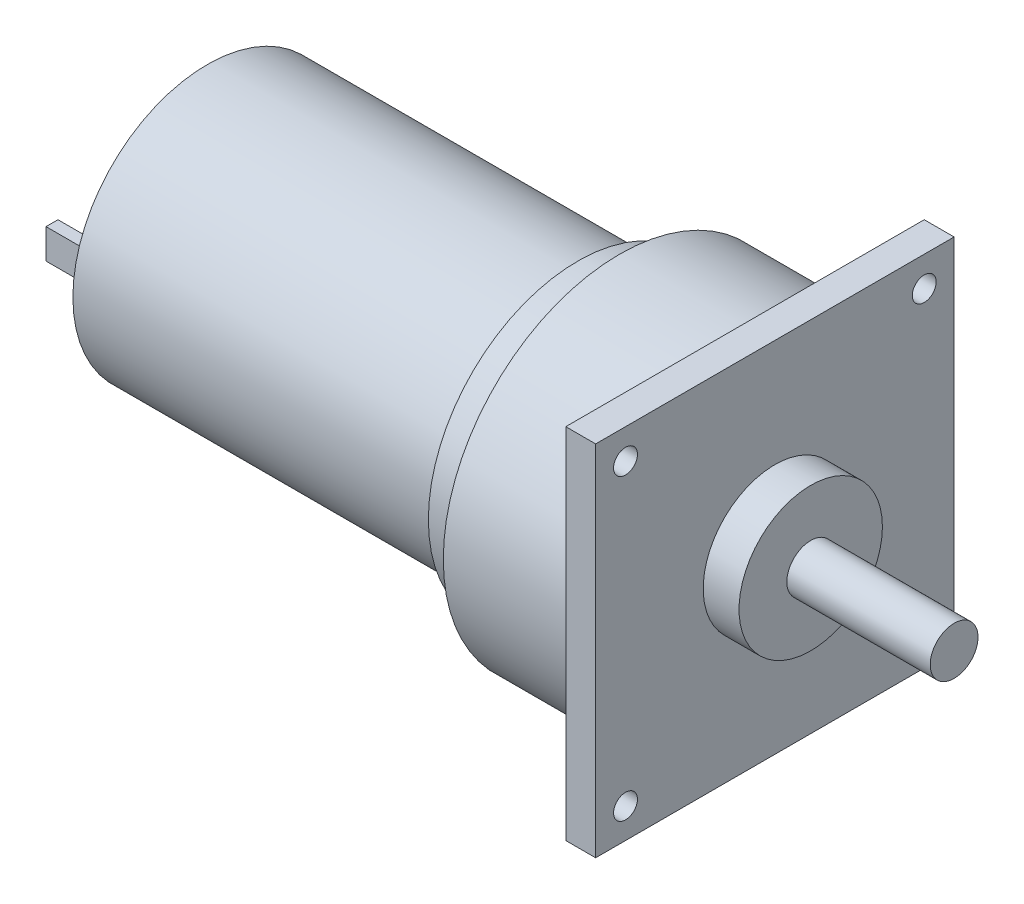
ISO-10303-21;
HEADER;
FILE_DESCRIPTION(('STEP AP214'),'2;1');
FILE_NAME('part.step','',(''),(''),'','','');
FILE_SCHEMA(('AUTOMOTIVE_DESIGN { 1 0 10303 214 1 1 1 1 }'));
ENDSEC;
DATA;
#1=APPLICATION_CONTEXT('core data for automotive mechanical design processes');
#2=APPLICATION_PROTOCOL_DEFINITION('international standard','automotive_design',2000,#1);
#3=PRODUCT_CONTEXT('',#1,'mechanical');
#4=PRODUCT('Part','Part','',(#3));
#5=PRODUCT_RELATED_PRODUCT_CATEGORY('part','',(#4));
#6=PRODUCT_DEFINITION_FORMATION('','',#4);
#7=PRODUCT_DEFINITION_CONTEXT('part definition',#1,'design');
#8=PRODUCT_DEFINITION('design','',#6,#7);
#9=PRODUCT_DEFINITION_SHAPE('','',#8);
#10=(LENGTH_UNIT() NAMED_UNIT(*) SI_UNIT(.MILLI.,.METRE.));
#11=(NAMED_UNIT(*) PLANE_ANGLE_UNIT() SI_UNIT($,.RADIAN.));
#12=(NAMED_UNIT(*) SI_UNIT($,.STERADIAN.) SOLID_ANGLE_UNIT());
#13=UNCERTAINTY_MEASURE_WITH_UNIT(LENGTH_MEASURE(1.E-05),#10,'distance_accuracy_value','');
#14=(GEOMETRIC_REPRESENTATION_CONTEXT(3) GLOBAL_UNCERTAINTY_ASSIGNED_CONTEXT((#13)) GLOBAL_UNIT_ASSIGNED_CONTEXT((#10,
#11,#12)) REPRESENTATION_CONTEXT('',''));
#15=CARTESIAN_POINT('',(0.,0.,0.));
#16=DIRECTION('',(0.,0.,1.));
#17=DIRECTION('',(1.,0.,0.));
#18=AXIS2_PLACEMENT_3D('',#15,#16,#17);
#19=CARTESIAN_POINT('',(-90.,0.,0.));
#20=DIRECTION('',(-1.,0.,0.));
#21=DIRECTION('',(0.,0.,1.));
#22=AXIS2_PLACEMENT_3D('',#19,#20,#21);
#23=PLANE('',#22);
#24=CARTESIAN_POINT('',(-90.,0.,0.));
#25=DIRECTION('',(-1.,0.,0.));
#26=DIRECTION('',(0.,0.,1.));
#27=AXIS2_PLACEMENT_3D('',#24,#25,#26);
#28=CIRCLE('',#27,2.5);
#29=CARTESIAN_POINT('',(-90.,0.,2.5));
#30=VERTEX_POINT('',#29);
#31=EDGE_CURVE('E212',#30,#30,#28,.T.);
#32=ORIENTED_EDGE('',*,*,#31,.F.);
#33=EDGE_LOOP('',(#32));
#34=FACE_BOUND('',#33,.T.);
#35=CARTESIAN_POINT('',(-90.,0.,0.));
#36=DIRECTION('',(-1.,0.,0.));
#37=DIRECTION('',(0.,0.,1.));
#38=AXIS2_PLACEMENT_3D('',#35,#36,#37);
#39=CIRCLE('',#38,22.5);
#40=CARTESIAN_POINT('',(-90.,0.,22.5));
#41=VERTEX_POINT('',#40);
#42=EDGE_CURVE('E264',#41,#41,#39,.T.);
#43=ORIENTED_EDGE('',*,*,#42,.T.);
#44=EDGE_LOOP('',(#43));
#45=FACE_BOUND('',#44,.T.);
#46=DIRECTION('',(0.,0.,-1.));
#47=VECTOR('',#46,1.);
#48=CARTESIAN_POINT('',(-90.,2.5,-17.));
#49=LINE('',#48,#47);
#50=CARTESIAN_POINT('',(-90.,2.5,-15.));
#51=VERTEX_POINT('',#50);
#52=CARTESIAN_POINT('',(-90.,2.5,-17.));
#53=VERTEX_POINT('',#52);
#54=EDGE_CURVE('E173',#51,#53,#49,.T.);
#55=ORIENTED_EDGE('',*,*,#54,.F.);
#56=DIRECTION('',(0.,1.,0.));
#57=VECTOR('',#56,1.);
#58=CARTESIAN_POINT('',(-90.,2.5,-15.));
#59=LINE('',#58,#57);
#60=CARTESIAN_POINT('',(-90.,-2.5,-15.));
#61=VERTEX_POINT('',#60);
#62=EDGE_CURVE('E168',#61,#51,#59,.T.);
#63=ORIENTED_EDGE('',*,*,#62,.F.);
#64=DIRECTION('',(0.,0.,1.));
#65=VECTOR('',#64,1.);
#66=CARTESIAN_POINT('',(-90.,-2.5,-17.));
#67=LINE('',#66,#65);
#68=CARTESIAN_POINT('',(-90.,-2.5,-17.));
#69=VERTEX_POINT('',#68);
#70=EDGE_CURVE('E183',#69,#61,#67,.T.);
#71=ORIENTED_EDGE('',*,*,#70,.F.);
#72=DIRECTION('',(0.,-1.,0.));
#73=VECTOR('',#72,1.);
#74=CARTESIAN_POINT('',(-90.,2.5,-17.));
#75=LINE('',#74,#73);
#76=EDGE_CURVE('E195',#53,#69,#75,.T.);
#77=ORIENTED_EDGE('',*,*,#76,.F.);
#78=EDGE_LOOP('',(#55,#63,#71,#77));
#79=FACE_BOUND('',#78,.T.);
#80=DIRECTION('',(0.,0.,-1.));
#81=VECTOR('',#80,1.);
#82=CARTESIAN_POINT('',(-90.,2.50000000000001,15.));
#83=LINE('',#82,#81);
#84=CARTESIAN_POINT('',(-90.,2.50000000000001,17.));
#85=VERTEX_POINT('',#84);
#86=CARTESIAN_POINT('',(-90.,2.50000000000001,15.));
#87=VERTEX_POINT('',#86);
#88=EDGE_CURVE('E664',#85,#87,#83,.T.);
#89=ORIENTED_EDGE('',*,*,#88,.F.);
#90=DIRECTION('',(0.,1.,0.));
#91=VECTOR('',#90,1.);
#92=CARTESIAN_POINT('',(-90.,2.50000000000001,17.));
#93=LINE('',#92,#91);
#94=CARTESIAN_POINT('',(-90.,-2.49999999999999,17.));
#95=VERTEX_POINT('',#94);
#96=EDGE_CURVE('E165',#95,#85,#93,.T.);
#97=ORIENTED_EDGE('',*,*,#96,.F.);
#98=DIRECTION('',(0.,0.,1.));
#99=VECTOR('',#98,1.);
#100=CARTESIAN_POINT('',(-90.,-2.49999999999999,15.));
#101=LINE('',#100,#99);
#102=CARTESIAN_POINT('',(-90.,-2.49999999999999,15.));
#103=VERTEX_POINT('',#102);
#104=EDGE_CURVE('E161',#103,#95,#101,.T.);
#105=ORIENTED_EDGE('',*,*,#104,.F.);
#106=DIRECTION('',(0.,-1.,0.));
#107=VECTOR('',#106,1.);
#108=CARTESIAN_POINT('',(-90.,2.50000000000001,15.));
#109=LINE('',#108,#107);
#110=EDGE_CURVE('E660',#87,#103,#109,.T.);
#111=ORIENTED_EDGE('',*,*,#110,.F.);
#112=EDGE_LOOP('',(#89,#97,#105,#111));
#113=FACE_BOUND('',#112,.T.);
#114=ADVANCED_FACE('F47',(#34,#45,#79,#113),#23,.T.);
#115=CARTESIAN_POINT('',(5.,30.,-30.));
#116=DIRECTION('',(0.,0.,1.));
#117=DIRECTION('',(0.,-1.,0.));
#118=AXIS2_PLACEMENT_3D('',#115,#116,#117);
#119=PLANE('',#118);
#120=DIRECTION('',(0.,1.,0.));
#121=VECTOR('',#120,1.);
#122=CARTESIAN_POINT('',(0.,30.,-30.));
#123=LINE('',#122,#121);
#124=CARTESIAN_POINT('',(0.,-30.,-30.));
#125=VERTEX_POINT('',#124);
#126=CARTESIAN_POINT('',(0.,30.,-30.));
#127=VERTEX_POINT('',#126);
#128=EDGE_CURVE('E280',#125,#127,#123,.T.);
#129=ORIENTED_EDGE('',*,*,#128,.T.);
#130=DIRECTION('',(-1.,0.,0.));
#131=VECTOR('',#130,1.);
#132=CARTESIAN_POINT('',(5.,30.,-30.));
#133=LINE('',#132,#131);
#134=CARTESIAN_POINT('',(5.,30.,-30.));
#135=VERTEX_POINT('',#134);
#136=EDGE_CURVE('E284',#135,#127,#133,.T.);
#137=ORIENTED_EDGE('',*,*,#136,.F.);
#138=DIRECTION('',(0.,1.,0.));
#139=VECTOR('',#138,1.);
#140=CARTESIAN_POINT('',(5.,30.,-30.));
#141=LINE('',#140,#139);
#142=CARTESIAN_POINT('',(5.,-30.,-30.));
#143=VERTEX_POINT('',#142);
#144=EDGE_CURVE('E285',#143,#135,#141,.T.);
#145=ORIENTED_EDGE('',*,*,#144,.F.);
#146=DIRECTION('',(-1.,0.,0.));
#147=VECTOR('',#146,1.);
#148=CARTESIAN_POINT('',(5.,-30.,-30.));
#149=LINE('',#148,#147);
#150=EDGE_CURVE('E299',#143,#125,#149,.T.);
#151=ORIENTED_EDGE('',*,*,#150,.T.);
#152=EDGE_LOOP('',(#129,#137,#145,#151));
#153=FACE_BOUND('',#152,.T.);
#154=ADVANCED_FACE('F49',(#153),#119,.F.);
#155=CARTESIAN_POINT('',(5.,30.,30.));
#156=DIRECTION('',(0.,-1.,0.));
#157=DIRECTION('',(0.,0.,-1.));
#158=AXIS2_PLACEMENT_3D('',#155,#156,#157);
#159=PLANE('',#158);
#160=DIRECTION('',(0.,0.,1.));
#161=VECTOR('',#160,1.);
#162=CARTESIAN_POINT('',(0.,30.,30.));
#163=LINE('',#162,#161);
#164=CARTESIAN_POINT('',(0.,30.,30.));
#165=VERTEX_POINT('',#164);
#166=EDGE_CURVE('E303',#127,#165,#163,.T.);
#167=ORIENTED_EDGE('',*,*,#166,.T.);
#168=DIRECTION('',(-1.,0.,0.));
#169=VECTOR('',#168,1.);
#170=CARTESIAN_POINT('',(5.,30.,30.));
#171=LINE('',#170,#169);
#172=CARTESIAN_POINT('',(5.,30.,30.));
#173=VERTEX_POINT('',#172);
#174=EDGE_CURVE('E318',#173,#165,#171,.T.);
#175=ORIENTED_EDGE('',*,*,#174,.F.);
#176=DIRECTION('',(0.,0.,1.));
#177=VECTOR('',#176,1.);
#178=CARTESIAN_POINT('',(5.,30.,30.));
#179=LINE('',#178,#177);
#180=EDGE_CURVE('E289',#135,#173,#179,.T.);
#181=ORIENTED_EDGE('',*,*,#180,.F.);
#182=ORIENTED_EDGE('',*,*,#136,.T.);
#183=EDGE_LOOP('',(#167,#175,#181,#182));
#184=FACE_BOUND('',#183,.T.);
#185=ADVANCED_FACE('F325',(#184),#159,.F.);
#186=CARTESIAN_POINT('',(5.,30.,30.));
#187=DIRECTION('',(0.,0.,-1.));
#188=DIRECTION('',(0.,1.,0.));
#189=AXIS2_PLACEMENT_3D('',#186,#187,#188);
#190=PLANE('',#189);
#191=DIRECTION('',(0.,-1.,0.));
#192=VECTOR('',#191,1.);
#193=CARTESIAN_POINT('',(0.,30.,30.));
#194=LINE('',#193,#192);
#195=CARTESIAN_POINT('',(0.,-30.,30.));
#196=VERTEX_POINT('',#195);
#197=EDGE_CURVE('E306',#165,#196,#194,.T.);
#198=ORIENTED_EDGE('',*,*,#197,.T.);
#199=DIRECTION('',(-1.,0.,0.));
#200=VECTOR('',#199,1.);
#201=CARTESIAN_POINT('',(5.,-30.,30.));
#202=LINE('',#201,#200);
#203=CARTESIAN_POINT('',(5.,-30.,30.));
#204=VERTEX_POINT('',#203);
#205=EDGE_CURVE('E314',#204,#196,#202,.T.);
#206=ORIENTED_EDGE('',*,*,#205,.F.);
#207=DIRECTION('',(0.,-1.,0.));
#208=VECTOR('',#207,1.);
#209=CARTESIAN_POINT('',(5.,30.,30.));
#210=LINE('',#209,#208);
#211=EDGE_CURVE('E293',#173,#204,#210,.T.);
#212=ORIENTED_EDGE('',*,*,#211,.F.);
#213=ORIENTED_EDGE('',*,*,#174,.T.);
#214=EDGE_LOOP('',(#198,#206,#212,#213));
#215=FACE_BOUND('',#214,.T.);
#216=ADVANCED_FACE('F337',(#215),#190,.F.);
#217=CARTESIAN_POINT('',(5.,-30.,30.));
#218=DIRECTION('',(0.,1.,0.));
#219=DIRECTION('',(0.,0.,1.));
#220=AXIS2_PLACEMENT_3D('',#217,#218,#219);
#221=PLANE('',#220);
#222=DIRECTION('',(0.,0.,-1.));
#223=VECTOR('',#222,1.);
#224=CARTESIAN_POINT('',(0.,-30.,30.));
#225=LINE('',#224,#223);
#226=EDGE_CURVE('E290',#196,#125,#225,.T.);
#227=ORIENTED_EDGE('',*,*,#226,.T.);
#228=ORIENTED_EDGE('',*,*,#150,.F.);
#229=DIRECTION('',(0.,0.,-1.));
#230=VECTOR('',#229,1.);
#231=CARTESIAN_POINT('',(5.,-30.,30.));
#232=LINE('',#231,#230);
#233=EDGE_CURVE('E296',#204,#143,#232,.T.);
#234=ORIENTED_EDGE('',*,*,#233,.F.);
#235=ORIENTED_EDGE('',*,*,#205,.T.);
#236=EDGE_LOOP('',(#227,#228,#234,#235));
#237=FACE_BOUND('',#236,.T.);
#238=ADVANCED_FACE('F341',(#237),#221,.F.);
#239=CARTESIAN_POINT('',(5.,0.,0.));
#240=DIRECTION('',(1.,0.,0.));
#241=DIRECTION('',(0.,0.,-1.));
#242=AXIS2_PLACEMENT_3D('',#239,#240,#241);
#243=PLANE('',#242);
#244=CARTESIAN_POINT('',(5.,0.,0.));
#245=DIRECTION('',(1.,0.,0.));
#246=DIRECTION('',(0.,0.,-1.));
#247=AXIS2_PLACEMENT_3D('',#244,#245,#246);
#248=CIRCLE('',#247,12.);
#249=CARTESIAN_POINT('',(5.,0.,-12.));
#250=VERTEX_POINT('',#249);
#251=EDGE_CURVE('E229',#250,#250,#248,.T.);
#252=ORIENTED_EDGE('',*,*,#251,.F.);
#253=EDGE_LOOP('',(#252));
#254=FACE_BOUND('',#253,.T.);
#255=CARTESIAN_POINT('',(5.,-25.,25.));
#256=DIRECTION('',(1.,0.,0.));
#257=DIRECTION('',(0.,0.,-1.));
#258=AXIS2_PLACEMENT_3D('',#255,#256,#257);
#259=CIRCLE('',#258,2.);
#260=CARTESIAN_POINT('',(5.,-25.,23.));
#261=VERTEX_POINT('',#260);
#262=EDGE_CURVE('E228',#261,#261,#259,.T.);
#263=ORIENTED_EDGE('',*,*,#262,.F.);
#264=EDGE_LOOP('',(#263));
#265=FACE_BOUND('',#264,.T.);
#266=CARTESIAN_POINT('',(5.,-25.,-25.));
#267=DIRECTION('',(1.,0.,0.));
#268=DIRECTION('',(0.,0.,-1.));
#269=AXIS2_PLACEMENT_3D('',#266,#267,#268);
#270=CIRCLE('',#269,2.);
#271=CARTESIAN_POINT('',(5.,-25.,-27.));
#272=VERTEX_POINT('',#271);
#273=EDGE_CURVE('E243',#272,#272,#270,.T.);
#274=ORIENTED_EDGE('',*,*,#273,.F.);
#275=EDGE_LOOP('',(#274));
#276=FACE_BOUND('',#275,.T.);
#277=CARTESIAN_POINT('',(5.,25.,-25.));
#278=DIRECTION('',(1.,0.,0.));
#279=DIRECTION('',(0.,0.,-1.));
#280=AXIS2_PLACEMENT_3D('',#277,#278,#279);
#281=CIRCLE('',#280,2.);
#282=CARTESIAN_POINT('',(5.,25.,-27.));
#283=VERTEX_POINT('',#282);
#284=EDGE_CURVE('E233',#283,#283,#281,.T.);
#285=ORIENTED_EDGE('',*,*,#284,.F.);
#286=EDGE_LOOP('',(#285));
#287=FACE_BOUND('',#286,.T.);
#288=CARTESIAN_POINT('',(5.,25.,25.));
#289=DIRECTION('',(1.,0.,0.));
#290=DIRECTION('',(0.,0.,-1.));
#291=AXIS2_PLACEMENT_3D('',#288,#289,#290);
#292=CIRCLE('',#291,2.);
#293=CARTESIAN_POINT('',(5.,25.,23.));
#294=VERTEX_POINT('',#293);
#295=EDGE_CURVE('E242',#294,#294,#292,.T.);
#296=ORIENTED_EDGE('',*,*,#295,.F.);
#297=EDGE_LOOP('',(#296));
#298=FACE_BOUND('',#297,.T.);
#299=ORIENTED_EDGE('',*,*,#144,.T.);
#300=ORIENTED_EDGE('',*,*,#180,.T.);
#301=ORIENTED_EDGE('',*,*,#211,.T.);
#302=ORIENTED_EDGE('',*,*,#233,.T.);
#303=EDGE_LOOP('',(#299,#300,#301,#302));
#304=FACE_BOUND('',#303,.T.);
#305=ADVANCED_FACE('F343',(#254,#265,#276,#287,#298,#304),#243,.T.);
#306=CARTESIAN_POINT('',(0.,0.,0.));
#307=DIRECTION('',(1.,0.,0.));
#308=DIRECTION('',(0.,0.,-1.));
#309=AXIS2_PLACEMENT_3D('',#306,#307,#308);
#310=PLANE('',#309);
#311=CARTESIAN_POINT('',(0.,-25.,25.));
#312=DIRECTION('',(1.,0.,0.));
#313=DIRECTION('',(0.,0.,-1.));
#314=AXIS2_PLACEMENT_3D('',#311,#312,#313);
#315=CIRCLE('',#314,2.);
#316=CARTESIAN_POINT('',(0.,-25.,23.));
#317=VERTEX_POINT('',#316);
#318=EDGE_CURVE('E247',#317,#317,#315,.F.);
#319=ORIENTED_EDGE('',*,*,#318,.F.);
#320=EDGE_LOOP('',(#319));
#321=FACE_BOUND('',#320,.T.);
#322=CARTESIAN_POINT('',(0.,-25.,-25.));
#323=DIRECTION('',(1.,0.,0.));
#324=DIRECTION('',(0.,0.,-1.));
#325=AXIS2_PLACEMENT_3D('',#322,#323,#324);
#326=CIRCLE('',#325,2.);
#327=CARTESIAN_POINT('',(0.,-25.,-27.));
#328=VERTEX_POINT('',#327);
#329=EDGE_CURVE('E238',#328,#328,#326,.F.);
#330=ORIENTED_EDGE('',*,*,#329,.F.);
#331=EDGE_LOOP('',(#330));
#332=FACE_BOUND('',#331,.T.);
#333=CARTESIAN_POINT('',(0.,25.,-25.));
#334=DIRECTION('',(1.,0.,0.));
#335=DIRECTION('',(0.,0.,-1.));
#336=AXIS2_PLACEMENT_3D('',#333,#334,#335);
#337=CIRCLE('',#336,2.);
#338=CARTESIAN_POINT('',(0.,25.,-27.));
#339=VERTEX_POINT('',#338);
#340=EDGE_CURVE('E237',#339,#339,#337,.F.);
#341=ORIENTED_EDGE('',*,*,#340,.F.);
#342=EDGE_LOOP('',(#341));
#343=FACE_BOUND('',#342,.T.);
#344=CARTESIAN_POINT('',(0.,25.,25.));
#345=DIRECTION('',(1.,0.,0.));
#346=DIRECTION('',(0.,0.,-1.));
#347=AXIS2_PLACEMENT_3D('',#344,#345,#346);
#348=CIRCLE('',#347,2.);
#349=CARTESIAN_POINT('',(0.,25.,23.));
#350=VERTEX_POINT('',#349);
#351=EDGE_CURVE('E260',#350,#350,#348,.F.);
#352=ORIENTED_EDGE('',*,*,#351,.F.);
#353=EDGE_LOOP('',(#352));
#354=FACE_BOUND('',#353,.T.);
#355=CARTESIAN_POINT('',(0.,0.,0.));
#356=DIRECTION('',(-1.,0.,0.));
#357=DIRECTION('',(0.,0.,1.));
#358=AXIS2_PLACEMENT_3D('',#355,#356,#357);
#359=CIRCLE('',#358,29.5);
#360=CARTESIAN_POINT('',(0.,0.,-29.5));
#361=VERTEX_POINT('',#360);
#362=EDGE_CURVE('E276',#361,#361,#359,.T.);
#363=ORIENTED_EDGE('',*,*,#362,.F.);
#364=EDGE_LOOP('',(#363));
#365=FACE_BOUND('',#364,.T.);
#366=ORIENTED_EDGE('',*,*,#128,.F.);
#367=ORIENTED_EDGE('',*,*,#226,.F.);
#368=ORIENTED_EDGE('',*,*,#197,.F.);
#369=ORIENTED_EDGE('',*,*,#166,.F.);
#370=EDGE_LOOP('',(#366,#367,#368,#369));
#371=FACE_BOUND('',#370,.T.);
#372=ADVANCED_FACE('F333',(#321,#332,#343,#354,#365,#371),#310,.F.);
#373=CARTESIAN_POINT('',(-21.,0.,0.));
#374=DIRECTION('',(1.,0.,0.));
#375=DIRECTION('',(0.,0.,-1.));
#376=AXIS2_PLACEMENT_3D('',#373,#374,#375);
#377=CYLINDRICAL_SURFACE('',#376,29.5);
#378=CARTESIAN_POINT('',(-21.,0.,0.));
#379=DIRECTION('',(-1.,0.,0.));
#380=DIRECTION('',(0.,0.,1.));
#381=AXIS2_PLACEMENT_3D('',#378,#379,#380);
#382=CIRCLE('',#381,29.5);
#383=CARTESIAN_POINT('',(-21.,0.,-29.5));
#384=VERTEX_POINT('',#383);
#385=EDGE_CURVE('E272',#384,#384,#382,.T.);
#386=CARTESIAN_POINT('',(-21.,0.,-29.5));
#387=CARTESIAN_POINT('',(-20.78125,0.,-29.5));
#388=CARTESIAN_POINT('',(-20.5625,0.,-29.5));
#389=CARTESIAN_POINT('',(-20.125,0.,-29.5));
#390=CARTESIAN_POINT('',(-19.90625,0.,-29.5));
#391=CARTESIAN_POINT('',(-19.46875,0.,-29.5));
#392=CARTESIAN_POINT('',(-19.25,0.,-29.5));
#393=CARTESIAN_POINT('',(-18.8125,0.,-29.5));
#394=CARTESIAN_POINT('',(-18.59375,0.,-29.5));
#395=CARTESIAN_POINT('',(-18.15625,0.,-29.5));
#396=CARTESIAN_POINT('',(-17.9375,0.,-29.5));
#397=CARTESIAN_POINT('',(-17.5,0.,-29.5));
#398=CARTESIAN_POINT('',(-17.28125,0.,-29.5));
#399=CARTESIAN_POINT('',(-16.84375,0.,-29.5));
#400=CARTESIAN_POINT('',(-16.625,0.,-29.5));
#401=CARTESIAN_POINT('',(-16.1875,0.,-29.5));
#402=CARTESIAN_POINT('',(-15.96875,0.,-29.5));
#403=CARTESIAN_POINT('',(-15.53125,0.,-29.5));
#404=CARTESIAN_POINT('',(-15.3125,0.,-29.5));
#405=CARTESIAN_POINT('',(-14.875,0.,-29.5));
#406=CARTESIAN_POINT('',(-14.65625,0.,-29.5));
#407=CARTESIAN_POINT('',(-14.21875,0.,-29.5));
#408=CARTESIAN_POINT('',(-14.,0.,-29.5));
#409=CARTESIAN_POINT('',(-13.5625,0.,-29.5));
#410=CARTESIAN_POINT('',(-13.34375,0.,-29.5));
#411=CARTESIAN_POINT('',(-12.90625,0.,-29.5));
#412=CARTESIAN_POINT('',(-12.6875,0.,-29.5));
#413=CARTESIAN_POINT('',(-12.25,0.,-29.5));
#414=CARTESIAN_POINT('',(-12.03125,0.,-29.5));
#415=CARTESIAN_POINT('',(-11.59375,0.,-29.5));
#416=CARTESIAN_POINT('',(-11.375,0.,-29.5));
#417=CARTESIAN_POINT('',(-10.9375,0.,-29.5));
#418=CARTESIAN_POINT('',(-10.71875,0.,-29.5));
#419=CARTESIAN_POINT('',(-10.28125,0.,-29.5));
#420=CARTESIAN_POINT('',(-10.0625,0.,-29.5));
#421=CARTESIAN_POINT('',(-9.625,0.,-29.5));
#422=CARTESIAN_POINT('',(-9.40625,0.,-29.5));
#423=CARTESIAN_POINT('',(-8.96875,0.,-29.5));
#424=CARTESIAN_POINT('',(-8.75,0.,-29.5));
#425=CARTESIAN_POINT('',(-8.3125,0.,-29.5));
#426=CARTESIAN_POINT('',(-8.09375,0.,-29.5));
#427=CARTESIAN_POINT('',(-7.65625,0.,-29.5));
#428=CARTESIAN_POINT('',(-7.4375,0.,-29.5));
#429=CARTESIAN_POINT('',(-7.,0.,-29.5));
#430=CARTESIAN_POINT('',(-6.78125,0.,-29.5));
#431=CARTESIAN_POINT('',(-6.34375,0.,-29.5));
#432=CARTESIAN_POINT('',(-6.125,0.,-29.5));
#433=CARTESIAN_POINT('',(-5.6875,0.,-29.5));
#434=CARTESIAN_POINT('',(-5.46875,0.,-29.5));
#435=CARTESIAN_POINT('',(-5.03125,0.,-29.5));
#436=CARTESIAN_POINT('',(-4.8125,0.,-29.5));
#437=CARTESIAN_POINT('',(-4.375,0.,-29.5));
#438=CARTESIAN_POINT('',(-4.15625,0.,-29.5));
#439=CARTESIAN_POINT('',(-3.71875,0.,-29.5));
#440=CARTESIAN_POINT('',(-3.5,0.,-29.5));
#441=CARTESIAN_POINT('',(-3.0625,0.,-29.5));
#442=CARTESIAN_POINT('',(-2.84375,0.,-29.5));
#443=CARTESIAN_POINT('',(-2.40625,0.,-29.5));
#444=CARTESIAN_POINT('',(-2.1875,0.,-29.5));
#445=CARTESIAN_POINT('',(-1.75,0.,-29.5));
#446=CARTESIAN_POINT('',(-1.53125,0.,-29.5));
#447=CARTESIAN_POINT('',(-1.09375,0.,-29.5));
#448=CARTESIAN_POINT('',(-0.875000000000001,0.,-29.5));
#449=CARTESIAN_POINT('',(-0.4375,0.,-29.5));
#450=CARTESIAN_POINT('',(-0.21875,0.,-29.5));
#451=CARTESIAN_POINT('',(0.,0.,-29.5));
#452=B_SPLINE_CURVE_WITH_KNOTS('',3,(#386,#387,#388,#389,#390,#391,#392,#393,#394,#395,#396,
#397,#398,#399,#400,#401,#402,#403,#404,#405,#406,#407,#408,#409,#410,#411,#412,#413,#414,#415,
#416,#417,#418,#419,#420,#421,#422,#423,#424,#425,#426,#427,#428,#429,#430,#431,#432,#433,#434,
#435,#436,#437,#438,#439,#440,#441,#442,#443,#444,#445,#446,#447,#448,#449,#450,#451),
.UNSPECIFIED.,.F.,.F.,(4,2,2,2,2,2,2,2,2,2,2,2,2,2,2,2,2,2,2,2,2,2,2,2,2,2,2,2,2,2,2,2,4),(0.,
0.656249999999997,1.3125,1.96875,2.625,3.28125,3.9375,4.59375,5.25,5.90625,6.5625,7.21875,7.875,
8.53125,9.1875,9.84375,10.5,11.15625,11.8125,12.46875,13.125,13.78125,14.4375,15.09375,15.75,
16.40625,17.0625,17.71875,18.375,19.03125,19.6875,20.34375,21.),.UNSPECIFIED.);
#453=EDGE_CURVE('BSEAM352',#384,#361,#452,.T.);
#454=ORIENTED_EDGE('',*,*,#385,.F.);
#455=ORIENTED_EDGE('',*,*,#362,.T.);
#456=ORIENTED_EDGE('',*,*,#453,.T.);
#457=ORIENTED_EDGE('',*,*,#453,.F.);
#458=EDGE_LOOP('',(#454,#456,#455,#457));
#459=FACE_BOUND('',#458,.T.);
#460=ADVANCED_FACE('F352',(#459),#377,.T.);
#461=CARTESIAN_POINT('',(-21.,0.,0.));
#462=DIRECTION('',(-1.,0.,0.));
#463=DIRECTION('',(0.,0.,1.));
#464=AXIS2_PLACEMENT_3D('',#461,#462,#463);
#465=PLANE('',#464);
#466=CARTESIAN_POINT('',(-21.,0.,0.));
#467=DIRECTION('',(-1.,0.,0.));
#468=DIRECTION('',(0.,0.,1.));
#469=AXIS2_PLACEMENT_3D('',#466,#467,#468);
#470=CIRCLE('',#469,25.);
#471=CARTESIAN_POINT('',(-21.,0.,25.));
#472=VERTEX_POINT('',#471);
#473=EDGE_CURVE('E57',#472,#472,#470,.T.);
#474=ORIENTED_EDGE('',*,*,#473,.F.);
#475=EDGE_LOOP('',(#474));
#476=FACE_BOUND('',#475,.T.);
#477=ORIENTED_EDGE('',*,*,#385,.T.);
#478=EDGE_LOOP('',(#477));
#479=FACE_BOUND('',#478,.T.);
#480=ADVANCED_FACE('F385',(#476,#479),#465,.T.);
#481=CARTESIAN_POINT('',(-28.,0.,0.));
#482=DIRECTION('',(1.,0.,0.));
#483=DIRECTION('',(0.,0.,-1.));
#484=AXIS2_PLACEMENT_3D('',#481,#482,#483);
#485=CYLINDRICAL_SURFACE('',#484,25.);
#486=CARTESIAN_POINT('',(-28.,0.,0.));
#487=DIRECTION('',(-1.,0.,0.));
#488=DIRECTION('',(0.,0.,1.));
#489=AXIS2_PLACEMENT_3D('',#486,#487,#488);
#490=CIRCLE('',#489,25.);
#491=CARTESIAN_POINT('',(-28.,0.,25.));
#492=VERTEX_POINT('',#491);
#493=EDGE_CURVE('E267',#492,#492,#490,.T.);
#494=ORIENTED_EDGE('',*,*,#493,.F.);
#495=EDGE_LOOP('',(#494));
#496=FACE_BOUND('',#495,.T.);
#497=ORIENTED_EDGE('',*,*,#473,.T.);
#498=EDGE_LOOP('',(#497));
#499=FACE_BOUND('',#498,.T.);
#500=ADVANCED_FACE('F381',(#496,#499),#485,.T.);
#501=CARTESIAN_POINT('',(-28.,0.,0.));
#502=DIRECTION('',(-1.,0.,0.));
#503=DIRECTION('',(0.,0.,1.));
#504=AXIS2_PLACEMENT_3D('',#501,#502,#503);
#505=PLANE('',#504);
#506=CARTESIAN_POINT('',(-28.,0.,0.));
#507=DIRECTION('',(-1.,0.,0.));
#508=DIRECTION('',(0.,0.,1.));
#509=AXIS2_PLACEMENT_3D('',#506,#507,#508);
#510=CIRCLE('',#509,22.5);
#511=CARTESIAN_POINT('',(-28.,0.,22.5));
#512=VERTEX_POINT('',#511);
#513=EDGE_CURVE('E11',#512,#512,#510,.T.);
#514=ORIENTED_EDGE('',*,*,#513,.F.);
#515=EDGE_LOOP('',(#514));
#516=FACE_BOUND('',#515,.T.);
#517=ORIENTED_EDGE('',*,*,#493,.T.);
#518=EDGE_LOOP('',(#517));
#519=FACE_BOUND('',#518,.T.);
#520=ADVANCED_FACE('F377',(#516,#519),#505,.T.);
#521=CARTESIAN_POINT('',(-90.,0.,0.));
#522=DIRECTION('',(1.,0.,0.));
#523=DIRECTION('',(0.,0.,-1.));
#524=AXIS2_PLACEMENT_3D('',#521,#522,#523);
#525=CYLINDRICAL_SURFACE('',#524,22.5);
#526=ORIENTED_EDGE('',*,*,#42,.F.);
#527=EDGE_LOOP('',(#526));
#528=FACE_BOUND('',#527,.T.);
#529=ORIENTED_EDGE('',*,*,#513,.T.);
#530=EDGE_LOOP('',(#529));
#531=FACE_BOUND('',#530,.T.);
#532=ADVANCED_FACE('F374',(#528,#531),#525,.T.);
#533=CARTESIAN_POINT('',(-90.001,25.,25.));
#534=DIRECTION('',(1.,0.,0.));
#535=DIRECTION('',(0.,0.,-1.));
#536=AXIS2_PLACEMENT_3D('',#533,#534,#535);
#537=CYLINDRICAL_SURFACE('',#536,2.);
#538=ORIENTED_EDGE('',*,*,#295,.T.);
#539=EDGE_LOOP('',(#538));
#540=FACE_BOUND('',#539,.T.);
#541=ORIENTED_EDGE('',*,*,#351,.T.);
#542=EDGE_LOOP('',(#541));
#543=FACE_BOUND('',#542,.T.);
#544=ADVANCED_FACE('F372',(#540,#543),#537,.F.);
#545=CARTESIAN_POINT('',(-90.001,25.,-25.));
#546=DIRECTION('',(1.,0.,0.));
#547=DIRECTION('',(0.,0.,-1.));
#548=AXIS2_PLACEMENT_3D('',#545,#546,#547);
#549=CYLINDRICAL_SURFACE('',#548,2.);
#550=ORIENTED_EDGE('',*,*,#284,.T.);
#551=EDGE_LOOP('',(#550));
#552=FACE_BOUND('',#551,.T.);
#553=ORIENTED_EDGE('',*,*,#340,.T.);
#554=EDGE_LOOP('',(#553));
#555=FACE_BOUND('',#554,.T.);
#556=ADVANCED_FACE('F424',(#552,#555),#549,.F.);
#557=CARTESIAN_POINT('',(-90.001,-25.,-25.));
#558=DIRECTION('',(1.,0.,0.));
#559=DIRECTION('',(0.,0.,-1.));
#560=AXIS2_PLACEMENT_3D('',#557,#558,#559);
#561=CYLINDRICAL_SURFACE('',#560,2.);
#562=ORIENTED_EDGE('',*,*,#273,.T.);
#563=EDGE_LOOP('',(#562));
#564=FACE_BOUND('',#563,.T.);
#565=ORIENTED_EDGE('',*,*,#329,.T.);
#566=EDGE_LOOP('',(#565));
#567=FACE_BOUND('',#566,.T.);
#568=ADVANCED_FACE('F431',(#564,#567),#561,.F.);
#569=CARTESIAN_POINT('',(-90.001,-25.,25.));
#570=DIRECTION('',(1.,0.,0.));
#571=DIRECTION('',(0.,0.,-1.));
#572=AXIS2_PLACEMENT_3D('',#569,#570,#571);
#573=CYLINDRICAL_SURFACE('',#572,2.);
#574=ORIENTED_EDGE('',*,*,#262,.T.);
#575=EDGE_LOOP('',(#574));
#576=FACE_BOUND('',#575,.T.);
#577=ORIENTED_EDGE('',*,*,#318,.T.);
#578=EDGE_LOOP('',(#577));
#579=FACE_BOUND('',#578,.T.);
#580=ADVANCED_FACE('F439',(#576,#579),#573,.F.);
#581=CARTESIAN_POINT('',(11.,0.,0.));
#582=DIRECTION('',(-1.,0.,0.));
#583=DIRECTION('',(0.,0.,1.));
#584=AXIS2_PLACEMENT_3D('',#581,#582,#583);
#585=CYLINDRICAL_SURFACE('',#584,12.);
#586=CARTESIAN_POINT('',(11.,0.,0.));
#587=DIRECTION('',(1.,0.,0.));
#588=DIRECTION('',(0.,0.,-1.));
#589=AXIS2_PLACEMENT_3D('',#586,#587,#588);
#590=CIRCLE('',#589,12.);
#591=CARTESIAN_POINT('',(11.,0.,-12.));
#592=VERTEX_POINT('',#591);
#593=EDGE_CURVE('E224',#592,#592,#590,.T.);
#594=ORIENTED_EDGE('',*,*,#593,.F.);
#595=EDGE_LOOP('',(#594));
#596=FACE_BOUND('',#595,.T.);
#597=ORIENTED_EDGE('',*,*,#251,.T.);
#598=EDGE_LOOP('',(#597));
#599=FACE_BOUND('',#598,.T.);
#600=ADVANCED_FACE('F445',(#596,#599),#585,.T.);
#601=CARTESIAN_POINT('',(11.,0.,0.));
#602=DIRECTION('',(1.,0.,0.));
#603=DIRECTION('',(0.,0.,-1.));
#604=AXIS2_PLACEMENT_3D('',#601,#602,#603);
#605=PLANE('',#604);
#606=CARTESIAN_POINT('',(11.,0.,0.));
#607=DIRECTION('',(1.,0.,0.));
#608=DIRECTION('',(0.,0.,-1.));
#609=AXIS2_PLACEMENT_3D('',#606,#607,#608);
#610=CIRCLE('',#609,4.);
#611=CARTESIAN_POINT('',(11.,0.,-4.));
#612=VERTEX_POINT('',#611);
#613=EDGE_CURVE('E51',#612,#612,#610,.F.);
#614=ORIENTED_EDGE('',*,*,#613,.T.);
#615=EDGE_LOOP('',(#614));
#616=FACE_BOUND('',#615,.T.);
#617=ORIENTED_EDGE('',*,*,#593,.T.);
#618=EDGE_LOOP('',(#617));
#619=FACE_BOUND('',#618,.T.);
#620=ADVANCED_FACE('F576',(#616,#619),#605,.T.);
#621=CARTESIAN_POINT('',(35.,0.,0.));
#622=DIRECTION('',(-1.,0.,0.));
#623=DIRECTION('',(0.,0.,1.));
#624=AXIS2_PLACEMENT_3D('',#621,#622,#623);
#625=CYLINDRICAL_SURFACE('',#624,4.);
#626=ORIENTED_EDGE('',*,*,#613,.F.);
#627=EDGE_LOOP('',(#626));
#628=FACE_BOUND('',#627,.T.);
#629=CARTESIAN_POINT('',(35.,0.,0.));
#630=DIRECTION('',(1.,0.,0.));
#631=DIRECTION('',(0.,0.,-1.));
#632=AXIS2_PLACEMENT_3D('',#629,#630,#631);
#633=CIRCLE('',#632,4.);
#634=CARTESIAN_POINT('',(35.,0.,-4.));
#635=VERTEX_POINT('',#634);
#636=EDGE_CURVE('E217',#635,#635,#633,.T.);
#637=ORIENTED_EDGE('',*,*,#636,.F.);
#638=EDGE_LOOP('',(#637));
#639=FACE_BOUND('',#638,.T.);
#640=ADVANCED_FACE('F572',(#628,#639),#625,.T.);
#641=CARTESIAN_POINT('',(35.,0.,0.));
#642=DIRECTION('',(1.,0.,0.));
#643=DIRECTION('',(0.,0.,-1.));
#644=AXIS2_PLACEMENT_3D('',#641,#642,#643);
#645=PLANE('',#644);
#646=ORIENTED_EDGE('',*,*,#636,.T.);
#647=EDGE_LOOP('',(#646));
#648=FACE_BOUND('',#647,.T.);
#649=ADVANCED_FACE('F455',(#648),#645,.T.);
#650=CARTESIAN_POINT('',(-100.,0.,0.));
#651=DIRECTION('',(1.,0.,0.));
#652=DIRECTION('',(0.,0.,-1.));
#653=AXIS2_PLACEMENT_3D('',#650,#651,#652);
#654=CYLINDRICAL_SURFACE('',#653,2.5);
#655=CARTESIAN_POINT('',(-100.,0.,0.));
#656=DIRECTION('',(-1.,0.,0.));
#657=DIRECTION('',(0.,0.,1.));
#658=AXIS2_PLACEMENT_3D('',#655,#656,#657);
#659=CIRCLE('',#658,2.5);
#660=CARTESIAN_POINT('',(-100.,0.,2.5));
#661=VERTEX_POINT('',#660);
#662=EDGE_CURVE('E213',#661,#661,#659,.T.);
#663=ORIENTED_EDGE('',*,*,#662,.F.);
#664=EDGE_LOOP('',(#663));
#665=FACE_BOUND('',#664,.T.);
#666=ORIENTED_EDGE('',*,*,#31,.T.);
#667=EDGE_LOOP('',(#666));
#668=FACE_BOUND('',#667,.T.);
#669=ADVANCED_FACE('F460',(#665,#668),#654,.T.);
#670=CARTESIAN_POINT('',(-100.,0.,0.));
#671=DIRECTION('',(-1.,0.,0.));
#672=DIRECTION('',(0.,0.,1.));
#673=AXIS2_PLACEMENT_3D('',#670,#671,#672);
#674=PLANE('',#673);
#675=ORIENTED_EDGE('',*,*,#662,.T.);
#676=EDGE_LOOP('',(#675));
#677=FACE_BOUND('',#676,.T.);
#678=ADVANCED_FACE('F465',(#677),#674,.T.);
#679=CARTESIAN_POINT('',(-100.,2.5,-15.));
#680=DIRECTION('',(0.,0.,-1.));
#681=DIRECTION('',(0.,1.,0.));
#682=AXIS2_PLACEMENT_3D('',#679,#680,#681);
#683=PLANE('',#682);
#684=ORIENTED_EDGE('',*,*,#62,.T.);
#685=DIRECTION('',(1.,0.,0.));
#686=VECTOR('',#685,1.);
#687=CARTESIAN_POINT('',(-100.,2.5,-15.));
#688=LINE('',#687,#686);
#689=CARTESIAN_POINT('',(-100.,2.5,-15.));
#690=VERTEX_POINT('',#689);
#691=EDGE_CURVE('E209',#690,#51,#688,.T.);
#692=ORIENTED_EDGE('',*,*,#691,.F.);
#693=DIRECTION('',(0.,1.,0.));
#694=VECTOR('',#693,1.);
#695=CARTESIAN_POINT('',(-100.,2.5,-15.));
#696=LINE('',#695,#694);
#697=CARTESIAN_POINT('',(-100.,-2.5,-15.));
#698=VERTEX_POINT('',#697);
#699=EDGE_CURVE('E178',#698,#690,#696,.T.);
#700=ORIENTED_EDGE('',*,*,#699,.F.);
#701=DIRECTION('',(1.,0.,0.));
#702=VECTOR('',#701,1.);
#703=CARTESIAN_POINT('',(-100.,-2.5,-15.));
#704=LINE('',#703,#702);
#705=EDGE_CURVE('E191',#698,#61,#704,.T.);
#706=ORIENTED_EDGE('',*,*,#705,.T.);
#707=EDGE_LOOP('',(#684,#692,#700,#706));
#708=FACE_BOUND('',#707,.T.);
#709=ADVANCED_FACE('F475',(#708),#683,.F.);
#710=CARTESIAN_POINT('',(-100.,2.5,-17.));
#711=DIRECTION('',(0.,-1.,0.));
#712=DIRECTION('',(0.,0.,-1.));
#713=AXIS2_PLACEMENT_3D('',#710,#711,#712);
#714=PLANE('',#713);
#715=ORIENTED_EDGE('',*,*,#54,.T.);
#716=DIRECTION('',(1.,0.,0.));
#717=VECTOR('',#716,1.);
#718=CARTESIAN_POINT('',(-100.,2.5,-17.));
#719=LINE('',#718,#717);
#720=CARTESIAN_POINT('',(-100.,2.5,-17.));
#721=VERTEX_POINT('',#720);
#722=EDGE_CURVE('E205',#721,#53,#719,.T.);
#723=ORIENTED_EDGE('',*,*,#722,.F.);
#724=DIRECTION('',(0.,0.,-1.));
#725=VECTOR('',#724,1.);
#726=CARTESIAN_POINT('',(-100.,2.5,-17.));
#727=LINE('',#726,#725);
#728=EDGE_CURVE('E182',#690,#721,#727,.T.);
#729=ORIENTED_EDGE('',*,*,#728,.F.);
#730=ORIENTED_EDGE('',*,*,#691,.T.);
#731=EDGE_LOOP('',(#715,#723,#729,#730));
#732=FACE_BOUND('',#731,.T.);
#733=ADVANCED_FACE('F485',(#732),#714,.F.);
#734=CARTESIAN_POINT('',(-100.,2.5,-17.));
#735=DIRECTION('',(0.,0.,1.));
#736=DIRECTION('',(1.,0.,0.));
#737=AXIS2_PLACEMENT_3D('',#734,#735,#736);
#738=PLANE('',#737);
#739=ORIENTED_EDGE('',*,*,#76,.T.);
#740=DIRECTION('',(1.,0.,0.));
#741=VECTOR('',#740,1.);
#742=CARTESIAN_POINT('',(-100.,-2.5,-17.));
#743=LINE('',#742,#741);
#744=CARTESIAN_POINT('',(-100.,-2.5,-17.));
#745=VERTEX_POINT('',#744);
#746=EDGE_CURVE('E73',#745,#69,#743,.T.);
#747=ORIENTED_EDGE('',*,*,#746,.F.);
#748=DIRECTION('',(0.,-1.,0.));
#749=VECTOR('',#748,1.);
#750=CARTESIAN_POINT('',(-100.,2.5,-17.));
#751=LINE('',#750,#749);
#752=EDGE_CURVE('E186',#721,#745,#751,.T.);
#753=ORIENTED_EDGE('',*,*,#752,.F.);
#754=ORIENTED_EDGE('',*,*,#722,.T.);
#755=EDGE_LOOP('',(#739,#747,#753,#754));
#756=FACE_BOUND('',#755,.T.);
#757=ADVANCED_FACE('F495',(#756),#738,.F.);
#758=CARTESIAN_POINT('',(-100.,-2.5,-17.));
#759=DIRECTION('',(0.,1.,0.));
#760=DIRECTION('',(0.,0.,1.));
#761=AXIS2_PLACEMENT_3D('',#758,#759,#760);
#762=PLANE('',#761);
#763=ORIENTED_EDGE('',*,*,#70,.T.);
#764=ORIENTED_EDGE('',*,*,#705,.F.);
#765=DIRECTION('',(0.,0.,1.));
#766=VECTOR('',#765,1.);
#767=CARTESIAN_POINT('',(-100.,-2.5,-17.));
#768=LINE('',#767,#766);
#769=EDGE_CURVE('E189',#745,#698,#768,.T.);
#770=ORIENTED_EDGE('',*,*,#769,.F.);
#771=ORIENTED_EDGE('',*,*,#746,.T.);
#772=EDGE_LOOP('',(#763,#764,#770,#771));
#773=FACE_BOUND('',#772,.T.);
#774=ADVANCED_FACE('F505',(#773),#762,.F.);
#775=CARTESIAN_POINT('',(-100.,0.,0.));
#776=DIRECTION('',(-1.,0.,0.));
#777=DIRECTION('',(0.,0.,1.));
#778=AXIS2_PLACEMENT_3D('',#775,#776,#777);
#779=PLANE('',#778);
#780=ORIENTED_EDGE('',*,*,#699,.T.);
#781=ORIENTED_EDGE('',*,*,#728,.T.);
#782=ORIENTED_EDGE('',*,*,#752,.T.);
#783=ORIENTED_EDGE('',*,*,#769,.T.);
#784=EDGE_LOOP('',(#780,#781,#782,#783));
#785=FACE_BOUND('',#784,.T.);
#786=ADVANCED_FACE('F515',(#785),#779,.T.);
#787=CARTESIAN_POINT('',(-100.,2.50000000000001,17.));
#788=DIRECTION('',(0.,0.,-1.));
#789=DIRECTION('',(-1.,0.,0.));
#790=AXIS2_PLACEMENT_3D('',#787,#788,#789);
#791=PLANE('',#790);
#792=ORIENTED_EDGE('',*,*,#96,.T.);
#793=DIRECTION('',(1.,0.,0.));
#794=VECTOR('',#793,1.);
#795=CARTESIAN_POINT('',(-100.,2.50000000000001,17.));
#796=LINE('',#795,#794);
#797=CARTESIAN_POINT('',(-100.,2.50000000000001,17.));
#798=VERTEX_POINT('',#797);
#799=EDGE_CURVE('E144',#798,#85,#796,.T.);
#800=ORIENTED_EDGE('',*,*,#799,.F.);
#801=DIRECTION('',(0.,1.,0.));
#802=VECTOR('',#801,1.);
#803=CARTESIAN_POINT('',(-100.,2.50000000000001,17.));
#804=LINE('',#803,#802);
#805=CARTESIAN_POINT('',(-100.,-2.49999999999999,17.));
#806=VERTEX_POINT('',#805);
#807=EDGE_CURVE('E152',#806,#798,#804,.T.);
#808=ORIENTED_EDGE('',*,*,#807,.F.);
#809=DIRECTION('',(1.,0.,0.));
#810=VECTOR('',#809,1.);
#811=CARTESIAN_POINT('',(-100.,-2.49999999999999,17.));
#812=LINE('',#811,#810);
#813=EDGE_CURVE('E656',#806,#95,#812,.T.);
#814=ORIENTED_EDGE('',*,*,#813,.T.);
#815=EDGE_LOOP('',(#792,#800,#808,#814));
#816=FACE_BOUND('',#815,.T.);
#817=ADVANCED_FACE('F163',(#816),#791,.F.);
#818=CARTESIAN_POINT('',(-100.,2.50000000000001,15.));
#819=DIRECTION('',(0.,-1.,0.));
#820=DIRECTION('',(0.,0.,-1.));
#821=AXIS2_PLACEMENT_3D('',#818,#819,#820);
#822=PLANE('',#821);
#823=ORIENTED_EDGE('',*,*,#88,.T.);
#824=DIRECTION('',(1.,0.,0.));
#825=VECTOR('',#824,1.);
#826=CARTESIAN_POINT('',(-100.,2.50000000000001,15.));
#827=LINE('',#826,#825);
#828=CARTESIAN_POINT('',(-100.,2.50000000000001,15.));
#829=VERTEX_POINT('',#828);
#830=EDGE_CURVE('E147',#829,#87,#827,.T.);
#831=ORIENTED_EDGE('',*,*,#830,.F.);
#832=DIRECTION('',(0.,0.,-1.));
#833=VECTOR('',#832,1.);
#834=CARTESIAN_POINT('',(-100.,2.50000000000001,15.));
#835=LINE('',#834,#833);
#836=EDGE_CURVE('E140',#798,#829,#835,.T.);
#837=ORIENTED_EDGE('',*,*,#836,.F.);
#838=ORIENTED_EDGE('',*,*,#799,.T.);
#839=EDGE_LOOP('',(#823,#831,#837,#838));
#840=FACE_BOUND('',#839,.T.);
#841=ADVANCED_FACE('F142',(#840),#822,.F.);
#842=CARTESIAN_POINT('',(-100.,2.50000000000001,15.));
#843=DIRECTION('',(0.,0.,1.));
#844=DIRECTION('',(0.,-1.,0.));
#845=AXIS2_PLACEMENT_3D('',#842,#843,#844);
#846=PLANE('',#845);
#847=ORIENTED_EDGE('',*,*,#110,.T.);
#848=DIRECTION('',(1.,0.,0.));
#849=VECTOR('',#848,1.);
#850=CARTESIAN_POINT('',(-100.,-2.49999999999999,15.));
#851=LINE('',#850,#849);
#852=CARTESIAN_POINT('',(-100.,-2.49999999999999,15.));
#853=VERTEX_POINT('',#852);
#854=EDGE_CURVE('E65',#853,#103,#851,.T.);
#855=ORIENTED_EDGE('',*,*,#854,.F.);
#856=DIRECTION('',(0.,-1.,0.));
#857=VECTOR('',#856,1.);
#858=CARTESIAN_POINT('',(-100.,2.50000000000001,15.));
#859=LINE('',#858,#857);
#860=EDGE_CURVE('E151',#829,#853,#859,.T.);
#861=ORIENTED_EDGE('',*,*,#860,.F.);
#862=ORIENTED_EDGE('',*,*,#830,.T.);
#863=EDGE_LOOP('',(#847,#855,#861,#862));
#864=FACE_BOUND('',#863,.T.);
#865=ADVANCED_FACE('F541',(#864),#846,.F.);
#866=CARTESIAN_POINT('',(-100.,-2.49999999999999,15.));
#867=DIRECTION('',(0.,1.,0.));
#868=DIRECTION('',(0.,0.,1.));
#869=AXIS2_PLACEMENT_3D('',#866,#867,#868);
#870=PLANE('',#869);
#871=ORIENTED_EDGE('',*,*,#104,.T.);
#872=ORIENTED_EDGE('',*,*,#813,.F.);
#873=DIRECTION('',(0.,0.,1.));
#874=VECTOR('',#873,1.);
#875=CARTESIAN_POINT('',(-100.,-2.49999999999999,15.));
#876=LINE('',#875,#874);
#877=EDGE_CURVE('E156',#853,#806,#876,.T.);
#878=ORIENTED_EDGE('',*,*,#877,.F.);
#879=ORIENTED_EDGE('',*,*,#854,.T.);
#880=EDGE_LOOP('',(#871,#872,#878,#879));
#881=FACE_BOUND('',#880,.T.);
#882=ADVANCED_FACE('F550',(#881),#870,.F.);
#883=CARTESIAN_POINT('',(-100.,0.,0.));
#884=DIRECTION('',(-1.,0.,0.));
#885=DIRECTION('',(0.,0.,1.));
#886=AXIS2_PLACEMENT_3D('',#883,#884,#885);
#887=PLANE('',#886);
#888=ORIENTED_EDGE('',*,*,#807,.T.);
#889=ORIENTED_EDGE('',*,*,#836,.T.);
#890=ORIENTED_EDGE('',*,*,#860,.T.);
#891=ORIENTED_EDGE('',*,*,#877,.T.);
#892=EDGE_LOOP('',(#888,#889,#890,#891));
#893=FACE_BOUND('',#892,.T.);
#894=ADVANCED_FACE('F155',(#893),#887,.T.);
#895=CLOSED_SHELL('',(#114,#154,#185,#216,#238,#305,#372,#460,#480,#500,#520,#532,#544,#556,
#568,#580,#600,#620,#640,#649,#669,#678,#709,#733,#757,#774,#786,#817,#841,#865,#882,#894));
#896=MANIFOLD_SOLID_BREP('B2',#895);
#897=ADVANCED_BREP_SHAPE_REPRESENTATION('',(#18,#896),#14);
#898=SHAPE_DEFINITION_REPRESENTATION(#9,#897);
ENDSEC;
END-ISO-10303-21;
